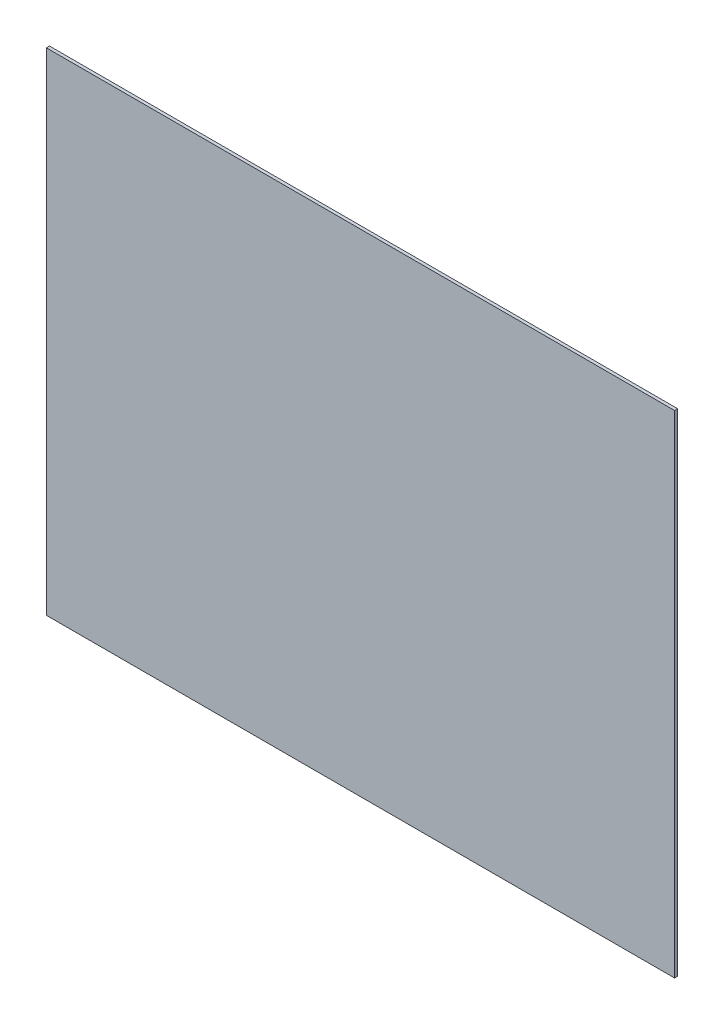
ISO-10303-21;
HEADER;
FILE_DESCRIPTION(('STEP AP214'),'2;1');
FILE_NAME('part.step','',(''),(''),'','','');
FILE_SCHEMA(('AUTOMOTIVE_DESIGN { 1 0 10303 214 1 1 1 1 }'));
ENDSEC;
DATA;
#1=APPLICATION_CONTEXT('core data for automotive mechanical design processes');
#2=APPLICATION_PROTOCOL_DEFINITION('international standard','automotive_design',2000,#1);
#3=PRODUCT_CONTEXT('',#1,'mechanical');
#4=PRODUCT('Part','Part','',(#3));
#5=PRODUCT_RELATED_PRODUCT_CATEGORY('part','',(#4));
#6=PRODUCT_DEFINITION_FORMATION('','',#4);
#7=PRODUCT_DEFINITION_CONTEXT('part definition',#1,'design');
#8=PRODUCT_DEFINITION('design','',#6,#7);
#9=PRODUCT_DEFINITION_SHAPE('','',#8);
#10=(LENGTH_UNIT() NAMED_UNIT(*) SI_UNIT(.MILLI.,.METRE.));
#11=(NAMED_UNIT(*) PLANE_ANGLE_UNIT() SI_UNIT($,.RADIAN.));
#12=(NAMED_UNIT(*) SI_UNIT($,.STERADIAN.) SOLID_ANGLE_UNIT());
#13=UNCERTAINTY_MEASURE_WITH_UNIT(LENGTH_MEASURE(1.E-05),#10,'distance_accuracy_value','');
#14=(GEOMETRIC_REPRESENTATION_CONTEXT(3) GLOBAL_UNCERTAINTY_ASSIGNED_CONTEXT((#13)) GLOBAL_UNIT_ASSIGNED_CONTEXT((#10,
#11,#12)) REPRESENTATION_CONTEXT('',''));
#15=CARTESIAN_POINT('',(0.,0.,0.));
#16=DIRECTION('',(0.,0.,1.));
#17=DIRECTION('',(1.,0.,0.));
#18=AXIS2_PLACEMENT_3D('',#15,#16,#17);
#19=CARTESIAN_POINT('',(232.537,181.95,2.286));
#20=DIRECTION('',(-1.,0.,0.));
#21=DIRECTION('',(0.,-1.,0.));
#22=AXIS2_PLACEMENT_3D('',#19,#20,#21);
#23=PLANE('',#22);
#24=DIRECTION('',(0.,1.,0.));
#25=VECTOR('',#24,1.);
#26=CARTESIAN_POINT('',(232.537,181.95,0.));
#27=LINE('',#26,#25);
#28=CARTESIAN_POINT('',(232.537,-181.95,0.));
#29=VERTEX_POINT('',#28);
#30=CARTESIAN_POINT('',(232.537,181.95,0.));
#31=VERTEX_POINT('',#30);
#32=EDGE_CURVE('E100',#29,#31,#27,.T.);
#33=ORIENTED_EDGE('',*,*,#32,.T.);
#34=DIRECTION('',(0.,0.,-1.));
#35=VECTOR('',#34,1.);
#36=CARTESIAN_POINT('',(232.537,181.95,2.286));
#37=LINE('',#36,#35);
#38=CARTESIAN_POINT('',(232.537,181.95,2.286));
#39=VERTEX_POINT('',#38);
#40=EDGE_CURVE('E11',#39,#31,#37,.T.);
#41=ORIENTED_EDGE('',*,*,#40,.F.);
#42=DIRECTION('',(0.,1.,0.));
#43=VECTOR('',#42,1.);
#44=CARTESIAN_POINT('',(232.537,181.95,2.286));
#45=LINE('',#44,#43);
#46=CARTESIAN_POINT('',(232.537,-181.95,2.286));
#47=VERTEX_POINT('',#46);
#48=EDGE_CURVE('E88',#47,#39,#45,.T.);
#49=ORIENTED_EDGE('',*,*,#48,.F.);
#50=DIRECTION('',(0.,0.,-1.));
#51=VECTOR('',#50,1.);
#52=CARTESIAN_POINT('',(232.537,-181.95,2.286));
#53=LINE('',#52,#51);
#54=EDGE_CURVE('E96',#47,#29,#53,.T.);
#55=ORIENTED_EDGE('',*,*,#54,.T.);
#56=EDGE_LOOP('',(#33,#41,#49,#55));
#57=FACE_BOUND('',#56,.T.);
#58=ADVANCED_FACE('F37',(#57),#23,.F.);
#59=CARTESIAN_POINT('',(-232.537,181.95,2.286));
#60=DIRECTION('',(0.,-1.,0.));
#61=DIRECTION('',(0.,0.,-1.));
#62=AXIS2_PLACEMENT_3D('',#59,#60,#61);
#63=PLANE('',#62);
#64=DIRECTION('',(-1.,0.,0.));
#65=VECTOR('',#64,1.);
#66=CARTESIAN_POINT('',(-232.537,181.95,0.));
#67=LINE('',#66,#65);
#68=CARTESIAN_POINT('',(-232.537,181.95,0.));
#69=VERTEX_POINT('',#68);
#70=EDGE_CURVE('E92',#31,#69,#67,.T.);
#71=ORIENTED_EDGE('',*,*,#70,.T.);
#72=DIRECTION('',(0.,0.,-1.));
#73=VECTOR('',#72,1.);
#74=CARTESIAN_POINT('',(-232.537,181.95,2.286));
#75=LINE('',#74,#73);
#76=CARTESIAN_POINT('',(-232.537,181.95,2.286));
#77=VERTEX_POINT('',#76);
#78=EDGE_CURVE('E45',#77,#69,#75,.T.);
#79=ORIENTED_EDGE('',*,*,#78,.F.);
#80=DIRECTION('',(-1.,0.,0.));
#81=VECTOR('',#80,1.);
#82=CARTESIAN_POINT('',(-232.537,181.95,2.286));
#83=LINE('',#82,#81);
#84=EDGE_CURVE('E83',#39,#77,#83,.T.);
#85=ORIENTED_EDGE('',*,*,#84,.F.);
#86=ORIENTED_EDGE('',*,*,#40,.T.);
#87=EDGE_LOOP('',(#71,#79,#85,#86));
#88=FACE_BOUND('',#87,.T.);
#89=ADVANCED_FACE('F91',(#88),#63,.F.);
#90=CARTESIAN_POINT('',(-232.537,181.95,2.286));
#91=DIRECTION('',(1.,0.,0.));
#92=DIRECTION('',(0.,1.,0.));
#93=AXIS2_PLACEMENT_3D('',#90,#91,#92);
#94=PLANE('',#93);
#95=DIRECTION('',(0.,-1.,0.));
#96=VECTOR('',#95,1.);
#97=CARTESIAN_POINT('',(-232.537,181.95,0.));
#98=LINE('',#97,#96);
#99=CARTESIAN_POINT('',(-232.537,-181.95,0.));
#100=VERTEX_POINT('',#99);
#101=EDGE_CURVE('E70',#69,#100,#98,.T.);
#102=ORIENTED_EDGE('',*,*,#101,.T.);
#103=DIRECTION('',(0.,0.,-1.));
#104=VECTOR('',#103,1.);
#105=CARTESIAN_POINT('',(-232.537,-181.95,2.286));
#106=LINE('',#105,#104);
#107=CARTESIAN_POINT('',(-232.537,-181.95,2.286));
#108=VERTEX_POINT('',#107);
#109=EDGE_CURVE('E93',#108,#100,#106,.T.);
#110=ORIENTED_EDGE('',*,*,#109,.F.);
#111=DIRECTION('',(0.,-1.,0.));
#112=VECTOR('',#111,1.);
#113=CARTESIAN_POINT('',(-232.537,181.95,2.286));
#114=LINE('',#113,#112);
#115=EDGE_CURVE('E86',#77,#108,#114,.T.);
#116=ORIENTED_EDGE('',*,*,#115,.F.);
#117=ORIENTED_EDGE('',*,*,#78,.T.);
#118=EDGE_LOOP('',(#102,#110,#116,#117));
#119=FACE_BOUND('',#118,.T.);
#120=ADVANCED_FACE('F94',(#119),#94,.F.);
#121=CARTESIAN_POINT('',(-232.537,-181.95,2.286));
#122=DIRECTION('',(0.,1.,0.));
#123=DIRECTION('',(0.,0.,1.));
#124=AXIS2_PLACEMENT_3D('',#121,#122,#123);
#125=PLANE('',#124);
#126=DIRECTION('',(1.,0.,0.));
#127=VECTOR('',#126,1.);
#128=CARTESIAN_POINT('',(-232.537,-181.95,0.));
#129=LINE('',#128,#127);
#130=EDGE_CURVE('E76',#100,#29,#129,.T.);
#131=ORIENTED_EDGE('',*,*,#130,.T.);
#132=ORIENTED_EDGE('',*,*,#54,.F.);
#133=DIRECTION('',(1.,0.,0.));
#134=VECTOR('',#133,1.);
#135=CARTESIAN_POINT('',(-232.537,-181.95,2.286));
#136=LINE('',#135,#134);
#137=EDGE_CURVE('E53',#108,#47,#136,.T.);
#138=ORIENTED_EDGE('',*,*,#137,.F.);
#139=ORIENTED_EDGE('',*,*,#109,.T.);
#140=EDGE_LOOP('',(#131,#132,#138,#139));
#141=FACE_BOUND('',#140,.T.);
#142=ADVANCED_FACE('F107',(#141),#125,.F.);
#143=CARTESIAN_POINT('',(0.,0.,2.286));
#144=DIRECTION('',(0.,0.,1.));
#145=DIRECTION('',(1.,0.,0.));
#146=AXIS2_PLACEMENT_3D('',#143,#144,#145);
#147=PLANE('',#146);
#148=ORIENTED_EDGE('',*,*,#48,.T.);
#149=ORIENTED_EDGE('',*,*,#84,.T.);
#150=ORIENTED_EDGE('',*,*,#115,.T.);
#151=ORIENTED_EDGE('',*,*,#137,.T.);
#152=EDGE_LOOP('',(#148,#149,#150,#151));
#153=FACE_BOUND('',#152,.T.);
#154=ADVANCED_FACE('F84',(#153),#147,.T.);
#155=CARTESIAN_POINT('',(0.,0.,0.));
#156=DIRECTION('',(0.,0.,1.));
#157=DIRECTION('',(1.,0.,0.));
#158=AXIS2_PLACEMENT_3D('',#155,#156,#157);
#159=PLANE('',#158);
#160=ORIENTED_EDGE('',*,*,#32,.F.);
#161=ORIENTED_EDGE('',*,*,#130,.F.);
#162=ORIENTED_EDGE('',*,*,#101,.F.);
#163=ORIENTED_EDGE('',*,*,#70,.F.);
#164=EDGE_LOOP('',(#160,#161,#162,#163));
#165=FACE_BOUND('',#164,.T.);
#166=ADVANCED_FACE('F110',(#165),#159,.F.);
#167=CLOSED_SHELL('',(#58,#89,#120,#142,#154,#166));
#168=MANIFOLD_SOLID_BREP('B2',#167);
#169=ADVANCED_BREP_SHAPE_REPRESENTATION('',(#18,#168),#14);
#170=SHAPE_DEFINITION_REPRESENTATION(#9,#169);
ENDSEC;
END-ISO-10303-21;
